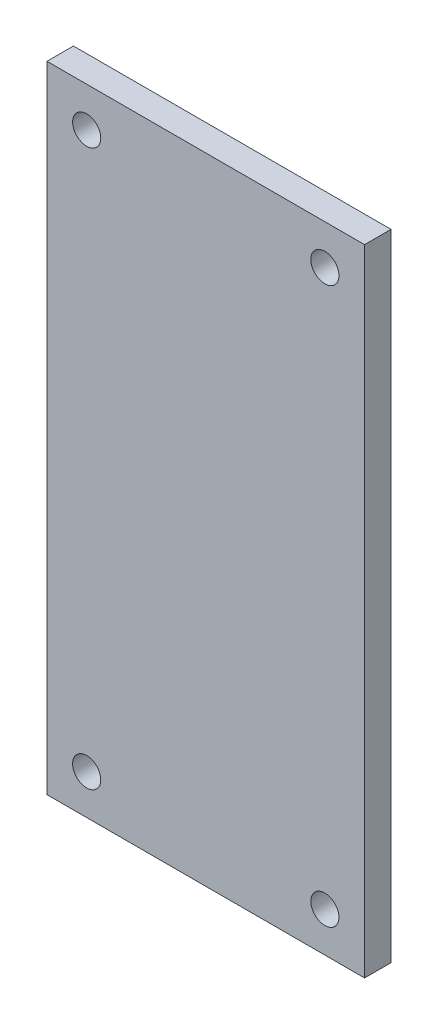
ISO-10303-21;
HEADER;
FILE_DESCRIPTION(('STEP AP214'),'2;1');
FILE_NAME('part.step','',(''),(''),'','','');
FILE_SCHEMA(('AUTOMOTIVE_DESIGN { 1 0 10303 214 1 1 1 1 }'));
ENDSEC;
DATA;
#1=APPLICATION_CONTEXT('core data for automotive mechanical design processes');
#2=APPLICATION_PROTOCOL_DEFINITION('international standard','automotive_design',2000,#1);
#3=PRODUCT_CONTEXT('',#1,'mechanical');
#4=PRODUCT('Part','Part','',(#3));
#5=PRODUCT_RELATED_PRODUCT_CATEGORY('part','',(#4));
#6=PRODUCT_DEFINITION_FORMATION('','',#4);
#7=PRODUCT_DEFINITION_CONTEXT('part definition',#1,'design');
#8=PRODUCT_DEFINITION('design','',#6,#7);
#9=PRODUCT_DEFINITION_SHAPE('','',#8);
#10=(LENGTH_UNIT() NAMED_UNIT(*) SI_UNIT(.MILLI.,.METRE.));
#11=(NAMED_UNIT(*) PLANE_ANGLE_UNIT() SI_UNIT($,.RADIAN.));
#12=(NAMED_UNIT(*) SI_UNIT($,.STERADIAN.) SOLID_ANGLE_UNIT());
#13=UNCERTAINTY_MEASURE_WITH_UNIT(LENGTH_MEASURE(1.E-05),#10,'distance_accuracy_value','');
#14=(GEOMETRIC_REPRESENTATION_CONTEXT(3) GLOBAL_UNCERTAINTY_ASSIGNED_CONTEXT((#13)) GLOBAL_UNIT_ASSIGNED_CONTEXT((#10,
#11,#12)) REPRESENTATION_CONTEXT('',''));
#15=CARTESIAN_POINT('',(0.,0.,0.));
#16=DIRECTION('',(0.,0.,1.));
#17=DIRECTION('',(1.,0.,0.));
#18=AXIS2_PLACEMENT_3D('',#15,#16,#17);
#19=CARTESIAN_POINT('',(0.,0.,6.35));
#20=DIRECTION('',(0.,0.,-1.));
#21=DIRECTION('',(-1.,0.,0.));
#22=AXIS2_PLACEMENT_3D('',#19,#20,#21);
#23=PLANE('',#22);
#24=DIRECTION('',(0.,1.,0.));
#25=VECTOR('',#24,1.);
#26=CARTESIAN_POINT('',(38.1,-76.2,6.35));
#27=LINE('',#26,#25);
#28=CARTESIAN_POINT('',(38.1,-76.2,6.35));
#29=VERTEX_POINT('',#28);
#30=CARTESIAN_POINT('',(38.1,76.2,6.35));
#31=VERTEX_POINT('',#30);
#32=EDGE_CURVE('E87',#29,#31,#27,.T.);
#33=ORIENTED_EDGE('',*,*,#32,.T.);
#34=DIRECTION('',(-1.,0.,0.));
#35=VECTOR('',#34,1.);
#36=CARTESIAN_POINT('',(-38.1,76.2,6.35));
#37=LINE('',#36,#35);
#38=CARTESIAN_POINT('',(-38.1,76.2,6.35));
#39=VERTEX_POINT('',#38);
#40=EDGE_CURVE('E82',#31,#39,#37,.T.);
#41=ORIENTED_EDGE('',*,*,#40,.T.);
#42=DIRECTION('',(0.,-1.,0.));
#43=VECTOR('',#42,1.);
#44=CARTESIAN_POINT('',(-38.1,-76.2,6.35));
#45=LINE('',#44,#43);
#46=CARTESIAN_POINT('',(-38.1,-76.2,6.35));
#47=VERTEX_POINT('',#46);
#48=EDGE_CURVE('E85',#39,#47,#45,.T.);
#49=ORIENTED_EDGE('',*,*,#48,.T.);
#50=DIRECTION('',(1.,0.,0.));
#51=VECTOR('',#50,1.);
#52=CARTESIAN_POINT('',(-38.1,-76.2,6.35));
#53=LINE('',#52,#51);
#54=EDGE_CURVE('E52',#47,#29,#53,.T.);
#55=ORIENTED_EDGE('',*,*,#54,.T.);
#56=EDGE_LOOP('',(#33,#41,#49,#55));
#57=FACE_BOUND('',#56,.T.);
#58=CARTESIAN_POINT('',(28.575,66.675,6.35));
#59=DIRECTION('',(0.,0.,1.));
#60=DIRECTION('',(1.,0.,0.));
#61=AXIS2_PLACEMENT_3D('',#58,#59,#60);
#62=CIRCLE('',#61,3.37819999999999);
#63=CARTESIAN_POINT('',(31.9532,66.675,6.35));
#64=VERTEX_POINT('',#63);
#65=EDGE_CURVE('E115',#64,#64,#62,.T.);
#66=ORIENTED_EDGE('',*,*,#65,.F.);
#67=EDGE_LOOP('',(#66));
#68=FACE_BOUND('',#67,.T.);
#69=CARTESIAN_POINT('',(-28.575,66.675,6.35));
#70=DIRECTION('',(0.,0.,1.));
#71=DIRECTION('',(1.,0.,0.));
#72=AXIS2_PLACEMENT_3D('',#69,#70,#71);
#73=CIRCLE('',#72,3.37819999999999);
#74=CARTESIAN_POINT('',(-25.1968,66.675,6.35));
#75=VERTEX_POINT('',#74);
#76=EDGE_CURVE('E121',#75,#75,#73,.T.);
#77=ORIENTED_EDGE('',*,*,#76,.F.);
#78=EDGE_LOOP('',(#77));
#79=FACE_BOUND('',#78,.T.);
#80=CARTESIAN_POINT('',(28.575,-66.675,6.35));
#81=DIRECTION('',(0.,0.,1.));
#82=DIRECTION('',(1.,0.,0.));
#83=AXIS2_PLACEMENT_3D('',#80,#81,#82);
#84=CIRCLE('',#83,3.37819999999999);
#85=CARTESIAN_POINT('',(31.9532,-66.675,6.35));
#86=VERTEX_POINT('',#85);
#87=EDGE_CURVE('E127',#86,#86,#84,.T.);
#88=ORIENTED_EDGE('',*,*,#87,.F.);
#89=EDGE_LOOP('',(#88));
#90=FACE_BOUND('',#89,.T.);
#91=CARTESIAN_POINT('',(-28.575,-66.675,6.35));
#92=DIRECTION('',(0.,0.,1.));
#93=DIRECTION('',(1.,0.,0.));
#94=AXIS2_PLACEMENT_3D('',#91,#92,#93);
#95=CIRCLE('',#94,3.37819999999999);
#96=CARTESIAN_POINT('',(-25.1968,-66.675,6.35));
#97=VERTEX_POINT('',#96);
#98=EDGE_CURVE('E133',#97,#97,#95,.T.);
#99=ORIENTED_EDGE('',*,*,#98,.F.);
#100=EDGE_LOOP('',(#99));
#101=FACE_BOUND('',#100,.T.);
#102=ADVANCED_FACE('F35',(#57,#68,#79,#90,#101),#23,.F.);
#103=CARTESIAN_POINT('',(38.1,-76.2,6.35));
#104=DIRECTION('',(-1.,0.,0.));
#105=DIRECTION('',(0.,0.,1.));
#106=AXIS2_PLACEMENT_3D('',#103,#104,#105);
#107=PLANE('',#106);
#108=DIRECTION('',(0.,1.,0.));
#109=VECTOR('',#108,1.);
#110=CARTESIAN_POINT('',(38.1,-76.2,0.));
#111=LINE('',#110,#109);
#112=CARTESIAN_POINT('',(38.1,-76.2,0.));
#113=VERTEX_POINT('',#112);
#114=CARTESIAN_POINT('',(38.1,76.2,0.));
#115=VERTEX_POINT('',#114);
#116=EDGE_CURVE('E99',#113,#115,#111,.T.);
#117=ORIENTED_EDGE('',*,*,#116,.T.);
#118=DIRECTION('',(0.,0.,-1.));
#119=VECTOR('',#118,1.);
#120=CARTESIAN_POINT('',(38.1,76.2,6.35));
#121=LINE('',#120,#119);
#122=EDGE_CURVE('E11',#31,#115,#121,.T.);
#123=ORIENTED_EDGE('',*,*,#122,.F.);
#124=ORIENTED_EDGE('',*,*,#32,.F.);
#125=DIRECTION('',(0.,0.,-1.));
#126=VECTOR('',#125,1.);
#127=CARTESIAN_POINT('',(38.1,-76.2,6.35));
#128=LINE('',#127,#126);
#129=EDGE_CURVE('E95',#29,#113,#128,.T.);
#130=ORIENTED_EDGE('',*,*,#129,.T.);
#131=EDGE_LOOP('',(#117,#123,#124,#130));
#132=FACE_BOUND('',#131,.T.);
#133=ADVANCED_FACE('F37',(#132),#107,.F.);
#134=CARTESIAN_POINT('',(-38.1,76.2,6.35));
#135=DIRECTION('',(0.,-1.,0.));
#136=DIRECTION('',(0.,0.,-1.));
#137=AXIS2_PLACEMENT_3D('',#134,#135,#136);
#138=PLANE('',#137);
#139=DIRECTION('',(-1.,0.,0.));
#140=VECTOR('',#139,1.);
#141=CARTESIAN_POINT('',(-38.1,76.2,0.));
#142=LINE('',#141,#140);
#143=CARTESIAN_POINT('',(-38.1,76.2,0.));
#144=VERTEX_POINT('',#143);
#145=EDGE_CURVE('E91',#115,#144,#142,.T.);
#146=ORIENTED_EDGE('',*,*,#145,.T.);
#147=DIRECTION('',(0.,0.,-1.));
#148=VECTOR('',#147,1.);
#149=CARTESIAN_POINT('',(-38.1,76.2,6.35));
#150=LINE('',#149,#148);
#151=EDGE_CURVE('E44',#39,#144,#150,.T.);
#152=ORIENTED_EDGE('',*,*,#151,.F.);
#153=ORIENTED_EDGE('',*,*,#40,.F.);
#154=ORIENTED_EDGE('',*,*,#122,.T.);
#155=EDGE_LOOP('',(#146,#152,#153,#154));
#156=FACE_BOUND('',#155,.T.);
#157=ADVANCED_FACE('F90',(#156),#138,.F.);
#158=CARTESIAN_POINT('',(-38.1,-76.2,6.35));
#159=DIRECTION('',(1.,0.,0.));
#160=DIRECTION('',(0.,0.,-1.));
#161=AXIS2_PLACEMENT_3D('',#158,#159,#160);
#162=PLANE('',#161);
#163=DIRECTION('',(0.,-1.,0.));
#164=VECTOR('',#163,1.);
#165=CARTESIAN_POINT('',(-38.1,-76.2,0.));
#166=LINE('',#165,#164);
#167=CARTESIAN_POINT('',(-38.1,-76.2,0.));
#168=VERTEX_POINT('',#167);
#169=EDGE_CURVE('E69',#144,#168,#166,.T.);
#170=ORIENTED_EDGE('',*,*,#169,.T.);
#171=DIRECTION('',(0.,0.,-1.));
#172=VECTOR('',#171,1.);
#173=CARTESIAN_POINT('',(-38.1,-76.2,6.35));
#174=LINE('',#173,#172);
#175=EDGE_CURVE('E92',#47,#168,#174,.T.);
#176=ORIENTED_EDGE('',*,*,#175,.F.);
#177=ORIENTED_EDGE('',*,*,#48,.F.);
#178=ORIENTED_EDGE('',*,*,#151,.T.);
#179=EDGE_LOOP('',(#170,#176,#177,#178));
#180=FACE_BOUND('',#179,.T.);
#181=ADVANCED_FACE('F93',(#180),#162,.F.);
#182=CARTESIAN_POINT('',(-38.1,-76.2,6.35));
#183=DIRECTION('',(0.,1.,0.));
#184=DIRECTION('',(0.,0.,1.));
#185=AXIS2_PLACEMENT_3D('',#182,#183,#184);
#186=PLANE('',#185);
#187=DIRECTION('',(1.,0.,0.));
#188=VECTOR('',#187,1.);
#189=CARTESIAN_POINT('',(-38.1,-76.2,0.));
#190=LINE('',#189,#188);
#191=EDGE_CURVE('E75',#168,#113,#190,.T.);
#192=ORIENTED_EDGE('',*,*,#191,.T.);
#193=ORIENTED_EDGE('',*,*,#129,.F.);
#194=ORIENTED_EDGE('',*,*,#54,.F.);
#195=ORIENTED_EDGE('',*,*,#175,.T.);
#196=EDGE_LOOP('',(#192,#193,#194,#195));
#197=FACE_BOUND('',#196,.T.);
#198=ADVANCED_FACE('F107',(#197),#186,.F.);
#199=CARTESIAN_POINT('',(0.,0.,0.));
#200=DIRECTION('',(0.,0.,-1.));
#201=DIRECTION('',(-1.,0.,0.));
#202=AXIS2_PLACEMENT_3D('',#199,#200,#201);
#203=PLANE('',#202);
#204=CARTESIAN_POINT('',(-28.575,-66.675,0.));
#205=DIRECTION('',(0.,0.,1.));
#206=DIRECTION('',(1.,0.,0.));
#207=AXIS2_PLACEMENT_3D('',#204,#205,#206);
#208=CIRCLE('',#207,3.37819999999999);
#209=CARTESIAN_POINT('',(-25.1968,-66.675,0.));
#210=VERTEX_POINT('',#209);
#211=EDGE_CURVE('E130',#210,#210,#208,.T.);
#212=ORIENTED_EDGE('',*,*,#211,.T.);
#213=EDGE_LOOP('',(#212));
#214=FACE_BOUND('',#213,.T.);
#215=CARTESIAN_POINT('',(28.575,-66.675,0.));
#216=DIRECTION('',(0.,0.,1.));
#217=DIRECTION('',(1.,0.,0.));
#218=AXIS2_PLACEMENT_3D('',#215,#216,#217);
#219=CIRCLE('',#218,3.37819999999999);
#220=CARTESIAN_POINT('',(31.9532,-66.675,0.));
#221=VERTEX_POINT('',#220);
#222=EDGE_CURVE('E124',#221,#221,#219,.T.);
#223=ORIENTED_EDGE('',*,*,#222,.T.);
#224=EDGE_LOOP('',(#223));
#225=FACE_BOUND('',#224,.T.);
#226=CARTESIAN_POINT('',(-28.575,66.675,0.));
#227=DIRECTION('',(0.,0.,1.));
#228=DIRECTION('',(1.,0.,0.));
#229=AXIS2_PLACEMENT_3D('',#226,#227,#228);
#230=CIRCLE('',#229,3.37819999999999);
#231=CARTESIAN_POINT('',(-25.1968,66.675,0.));
#232=VERTEX_POINT('',#231);
#233=EDGE_CURVE('E118',#232,#232,#230,.T.);
#234=ORIENTED_EDGE('',*,*,#233,.T.);
#235=EDGE_LOOP('',(#234));
#236=FACE_BOUND('',#235,.T.);
#237=CARTESIAN_POINT('',(28.575,66.675,0.));
#238=DIRECTION('',(0.,0.,1.));
#239=DIRECTION('',(1.,0.,0.));
#240=AXIS2_PLACEMENT_3D('',#237,#238,#239);
#241=CIRCLE('',#240,3.37819999999999);
#242=CARTESIAN_POINT('',(31.9532,66.675,0.));
#243=VERTEX_POINT('',#242);
#244=EDGE_CURVE('E102',#243,#243,#241,.T.);
#245=ORIENTED_EDGE('',*,*,#244,.T.);
#246=EDGE_LOOP('',(#245));
#247=FACE_BOUND('',#246,.T.);
#248=ORIENTED_EDGE('',*,*,#116,.F.);
#249=ORIENTED_EDGE('',*,*,#191,.F.);
#250=ORIENTED_EDGE('',*,*,#169,.F.);
#251=ORIENTED_EDGE('',*,*,#145,.F.);
#252=EDGE_LOOP('',(#248,#249,#250,#251));
#253=FACE_BOUND('',#252,.T.);
#254=ADVANCED_FACE('F110',(#214,#225,#236,#247,#253),#203,.T.);
#255=CARTESIAN_POINT('',(28.575,66.675,6.35));
#256=DIRECTION('',(0.,0.,1.));
#257=DIRECTION('',(1.,0.,0.));
#258=AXIS2_PLACEMENT_3D('',#255,#256,#257);
#259=CYLINDRICAL_SURFACE('',#258,3.37819999999999);
#260=ORIENTED_EDGE('',*,*,#244,.F.);
#261=EDGE_LOOP('',(#260));
#262=FACE_BOUND('',#261,.T.);
#263=ORIENTED_EDGE('',*,*,#65,.T.);
#264=EDGE_LOOP('',(#263));
#265=FACE_BOUND('',#264,.T.);
#266=ADVANCED_FACE('F146',(#262,#265),#259,.F.);
#267=CARTESIAN_POINT('',(-28.575,66.675,6.35));
#268=DIRECTION('',(0.,0.,1.));
#269=DIRECTION('',(1.,0.,0.));
#270=AXIS2_PLACEMENT_3D('',#267,#268,#269);
#271=CYLINDRICAL_SURFACE('',#270,3.37819999999999);
#272=ORIENTED_EDGE('',*,*,#233,.F.);
#273=EDGE_LOOP('',(#272));
#274=FACE_BOUND('',#273,.T.);
#275=ORIENTED_EDGE('',*,*,#76,.T.);
#276=EDGE_LOOP('',(#275));
#277=FACE_BOUND('',#276,.T.);
#278=ADVANCED_FACE('F178',(#274,#277),#271,.F.);
#279=CARTESIAN_POINT('',(28.575,-66.675,6.35));
#280=DIRECTION('',(0.,0.,1.));
#281=DIRECTION('',(1.,0.,0.));
#282=AXIS2_PLACEMENT_3D('',#279,#280,#281);
#283=CYLINDRICAL_SURFACE('',#282,3.37819999999999);
#284=ORIENTED_EDGE('',*,*,#222,.F.);
#285=EDGE_LOOP('',(#284));
#286=FACE_BOUND('',#285,.T.);
#287=ORIENTED_EDGE('',*,*,#87,.T.);
#288=EDGE_LOOP('',(#287));
#289=FACE_BOUND('',#288,.T.);
#290=ADVANCED_FACE('F185',(#286,#289),#283,.F.);
#291=CARTESIAN_POINT('',(-28.575,-66.675,6.35));
#292=DIRECTION('',(0.,0.,1.));
#293=DIRECTION('',(1.,0.,0.));
#294=AXIS2_PLACEMENT_3D('',#291,#292,#293);
#295=CYLINDRICAL_SURFACE('',#294,3.37819999999999);
#296=ORIENTED_EDGE('',*,*,#211,.F.);
#297=EDGE_LOOP('',(#296));
#298=FACE_BOUND('',#297,.T.);
#299=ORIENTED_EDGE('',*,*,#98,.T.);
#300=EDGE_LOOP('',(#299));
#301=FACE_BOUND('',#300,.T.);
#302=ADVANCED_FACE('F137',(#298,#301),#295,.F.);
#303=CLOSED_SHELL('',(#102,#133,#157,#181,#198,#254,#266,#278,#290,#302));
#304=MANIFOLD_SOLID_BREP('B2',#303);
#305=ADVANCED_BREP_SHAPE_REPRESENTATION('',(#18,#304),#14);
#306=SHAPE_DEFINITION_REPRESENTATION(#9,#305);
ENDSEC;
END-ISO-10303-21;
